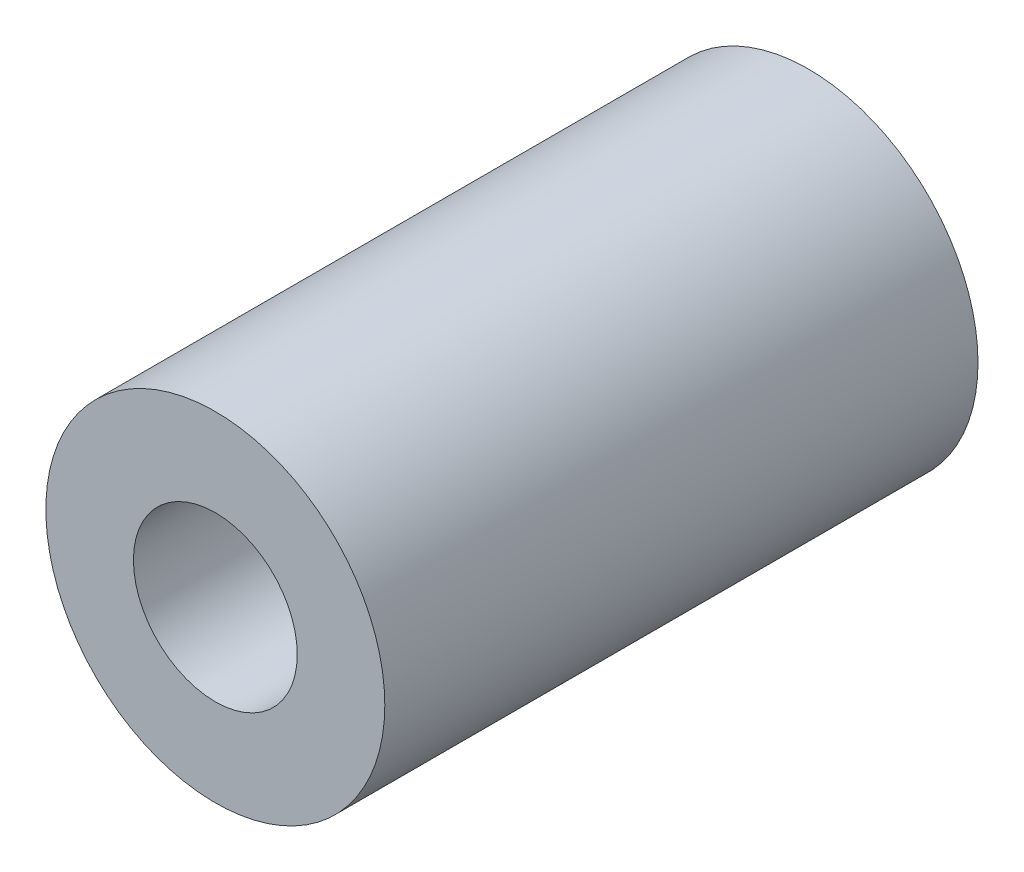
ISO-10303-21;
HEADER;
FILE_DESCRIPTION(('STEP AP214'),'2;1');
FILE_NAME('part.step','',(''),(''),'','','');
FILE_SCHEMA(('AUTOMOTIVE_DESIGN { 1 0 10303 214 1 1 1 1 }'));
ENDSEC;
DATA;
#1=APPLICATION_CONTEXT('core data for automotive mechanical design processes');
#2=APPLICATION_PROTOCOL_DEFINITION('international standard','automotive_design',2000,#1);
#3=PRODUCT_CONTEXT('',#1,'mechanical');
#4=PRODUCT('Part','Part','',(#3));
#5=PRODUCT_RELATED_PRODUCT_CATEGORY('part','',(#4));
#6=PRODUCT_DEFINITION_FORMATION('','',#4);
#7=PRODUCT_DEFINITION_CONTEXT('part definition',#1,'design');
#8=PRODUCT_DEFINITION('design','',#6,#7);
#9=PRODUCT_DEFINITION_SHAPE('','',#8);
#10=(LENGTH_UNIT() NAMED_UNIT(*) SI_UNIT(.MILLI.,.METRE.));
#11=(NAMED_UNIT(*) PLANE_ANGLE_UNIT() SI_UNIT($,.RADIAN.));
#12=(NAMED_UNIT(*) SI_UNIT($,.STERADIAN.) SOLID_ANGLE_UNIT());
#13=UNCERTAINTY_MEASURE_WITH_UNIT(LENGTH_MEASURE(1.E-05),#10,'distance_accuracy_value','');
#14=(GEOMETRIC_REPRESENTATION_CONTEXT(3) GLOBAL_UNCERTAINTY_ASSIGNED_CONTEXT((#13)) GLOBAL_UNIT_ASSIGNED_CONTEXT((#10,
#11,#12)) REPRESENTATION_CONTEXT('',''));
#15=CARTESIAN_POINT('',(0.,0.,0.));
#16=DIRECTION('',(0.,0.,1.));
#17=DIRECTION('',(1.,0.,0.));
#18=AXIS2_PLACEMENT_3D('',#15,#16,#17);
#19=CARTESIAN_POINT('',(0.,0.,52.5));
#20=DIRECTION('',(0.,0.,1.));
#21=DIRECTION('',(1.,0.,0.));
#22=AXIS2_PLACEMENT_3D('',#19,#20,#21);
#23=PLANE('',#22);
#24=CARTESIAN_POINT('',(0.,0.,52.5));
#25=DIRECTION('',(0.,0.,1.));
#26=DIRECTION('',(1.,0.,0.));
#27=AXIS2_PLACEMENT_3D('',#24,#25,#26);
#28=CIRCLE('',#27,30.);
#29=CARTESIAN_POINT('',(30.,0.,52.5));
#30=VERTEX_POINT('',#29);
#31=EDGE_CURVE('E10',#30,#30,#28,.T.);
#32=ORIENTED_EDGE('',*,*,#31,.T.);
#33=EDGE_LOOP('',(#32));
#34=FACE_BOUND('',#33,.T.);
#35=CARTESIAN_POINT('',(0.,0.,52.5));
#36=DIRECTION('',(0.,0.,1.));
#37=DIRECTION('',(1.,0.,0.));
#38=AXIS2_PLACEMENT_3D('',#35,#36,#37);
#39=CIRCLE('',#38,14.5);
#40=CARTESIAN_POINT('',(14.5,0.,52.5));
#41=VERTEX_POINT('',#40);
#42=EDGE_CURVE('E42',#41,#41,#39,.T.);
#43=ORIENTED_EDGE('',*,*,#42,.F.);
#44=EDGE_LOOP('',(#43));
#45=FACE_BOUND('',#44,.T.);
#46=ADVANCED_FACE('F31',(#34,#45),#23,.T.);
#47=CARTESIAN_POINT('',(0.,0.,-52.5));
#48=DIRECTION('',(0.,0.,1.));
#49=DIRECTION('',(1.,0.,0.));
#50=AXIS2_PLACEMENT_3D('',#47,#48,#49);
#51=PLANE('',#50);
#52=CARTESIAN_POINT('',(0.,0.,-52.5));
#53=DIRECTION('',(0.,0.,1.));
#54=DIRECTION('',(1.,0.,0.));
#55=AXIS2_PLACEMENT_3D('',#52,#53,#54);
#56=CIRCLE('',#55,30.);
#57=CARTESIAN_POINT('',(30.,0.,-52.5));
#58=VERTEX_POINT('',#57);
#59=EDGE_CURVE('E35',#58,#58,#56,.T.);
#60=ORIENTED_EDGE('',*,*,#59,.F.);
#61=EDGE_LOOP('',(#60));
#62=FACE_BOUND('',#61,.T.);
#63=CARTESIAN_POINT('',(0.,0.,-52.5));
#64=DIRECTION('',(0.,0.,1.));
#65=DIRECTION('',(1.,0.,0.));
#66=AXIS2_PLACEMENT_3D('',#63,#64,#65);
#67=CIRCLE('',#66,14.5);
#68=CARTESIAN_POINT('',(14.5,0.,-52.5));
#69=VERTEX_POINT('',#68);
#70=EDGE_CURVE('E44',#69,#69,#67,.T.);
#71=ORIENTED_EDGE('',*,*,#70,.T.);
#72=EDGE_LOOP('',(#71));
#73=FACE_BOUND('',#72,.T.);
#74=ADVANCED_FACE('F54',(#62,#73),#51,.F.);
#75=CARTESIAN_POINT('',(0.,0.,52.5));
#76=DIRECTION('',(0.,0.,-1.));
#77=DIRECTION('',(-1.,0.,0.));
#78=AXIS2_PLACEMENT_3D('',#75,#76,#77);
#79=CYLINDRICAL_SURFACE('',#78,30.);
#80=ORIENTED_EDGE('',*,*,#31,.F.);
#81=EDGE_LOOP('',(#80));
#82=FACE_BOUND('',#81,.T.);
#83=ORIENTED_EDGE('',*,*,#59,.T.);
#84=EDGE_LOOP('',(#83));
#85=FACE_BOUND('',#84,.T.);
#86=ADVANCED_FACE('F33',(#82,#85),#79,.T.);
#87=CARTESIAN_POINT('',(0.,0.,52.5));
#88=DIRECTION('',(0.,0.,-1.));
#89=DIRECTION('',(-1.,0.,0.));
#90=AXIS2_PLACEMENT_3D('',#87,#88,#89);
#91=CYLINDRICAL_SURFACE('',#90,14.5);
#92=ORIENTED_EDGE('',*,*,#42,.T.);
#93=EDGE_LOOP('',(#92));
#94=FACE_BOUND('',#93,.T.);
#95=ORIENTED_EDGE('',*,*,#70,.F.);
#96=EDGE_LOOP('',(#95));
#97=FACE_BOUND('',#96,.T.);
#98=ADVANCED_FACE('F50',(#94,#97),#91,.F.);
#99=CLOSED_SHELL('',(#46,#74,#86,#98));
#100=MANIFOLD_SOLID_BREP('B2',#99);
#101=ADVANCED_BREP_SHAPE_REPRESENTATION('',(#18,#100),#14);
#102=SHAPE_DEFINITION_REPRESENTATION(#9,#101);
ENDSEC;
END-ISO-10303-21;
